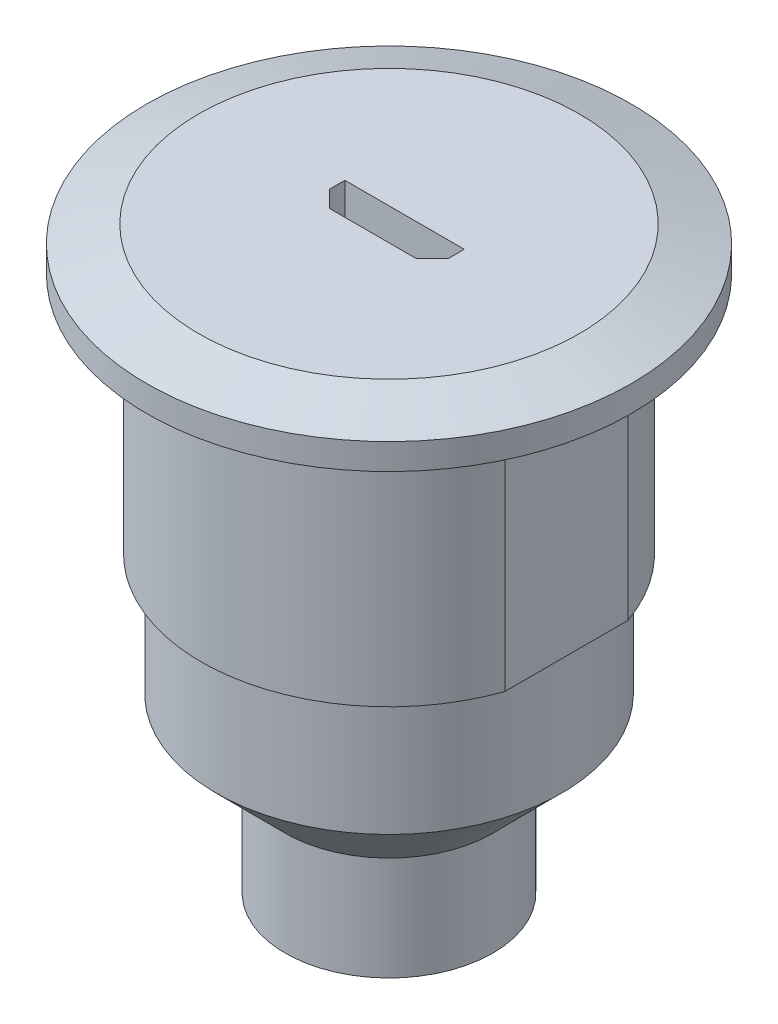
ISO-10303-21;
HEADER;
FILE_DESCRIPTION(('STEP AP214'),'2;1');
FILE_NAME('part.step','',(''),(''),'','','');
FILE_SCHEMA(('AUTOMOTIVE_DESIGN { 1 0 10303 214 1 1 1 1 }'));
ENDSEC;
DATA;
#1=APPLICATION_CONTEXT('core data for automotive mechanical design processes');
#2=APPLICATION_PROTOCOL_DEFINITION('international standard','automotive_design',2000,#1);
#3=PRODUCT_CONTEXT('',#1,'mechanical');
#4=PRODUCT('Part','Part','',(#3));
#5=PRODUCT_RELATED_PRODUCT_CATEGORY('part','',(#4));
#6=PRODUCT_DEFINITION_FORMATION('','',#4);
#7=PRODUCT_DEFINITION_CONTEXT('part definition',#1,'design');
#8=PRODUCT_DEFINITION('design','',#6,#7);
#9=PRODUCT_DEFINITION_SHAPE('','',#8);
#10=(LENGTH_UNIT() NAMED_UNIT(*) SI_UNIT(.MILLI.,.METRE.));
#11=(NAMED_UNIT(*) PLANE_ANGLE_UNIT() SI_UNIT($,.RADIAN.));
#12=(NAMED_UNIT(*) SI_UNIT($,.STERADIAN.) SOLID_ANGLE_UNIT());
#13=UNCERTAINTY_MEASURE_WITH_UNIT(LENGTH_MEASURE(1.E-05),#10,'distance_accuracy_value','');
#14=(GEOMETRIC_REPRESENTATION_CONTEXT(3) GLOBAL_UNCERTAINTY_ASSIGNED_CONTEXT((#13)) GLOBAL_UNIT_ASSIGNED_CONTEXT((#10,
#11,#12)) REPRESENTATION_CONTEXT('',''));
#15=CARTESIAN_POINT('',(0.,0.,0.));
#16=DIRECTION('',(0.,0.,1.));
#17=DIRECTION('',(1.,0.,0.));
#18=AXIS2_PLACEMENT_3D('',#15,#16,#17);
#19=CARTESIAN_POINT('',(0.,33.5,0.));
#20=DIRECTION('',(0.,1.,0.));
#21=DIRECTION('',(-1.,0.,0.));
#22=AXIS2_PLACEMENT_3D('',#19,#20,#21);
#23=CYLINDRICAL_SURFACE('',#22,10.85);
#24=DIRECTION('',(0.,1.,0.));
#25=VECTOR('',#24,1.);
#26=CARTESIAN_POINT('',(-10.25,33.5,-3.55808937493144));
#27=LINE('',#26,#25);
#28=CARTESIAN_POINT('',(-10.25,17.,-3.55808937493143));
#29=VERTEX_POINT('',#28);
#30=CARTESIAN_POINT('',(-10.25,31.,-3.55808937493144));
#31=VERTEX_POINT('',#30);
#32=EDGE_CURVE('E49',#29,#31,#27,.T.);
#33=ORIENTED_EDGE('',*,*,#32,.T.);
#34=CARTESIAN_POINT('',(0.,31.,0.));
#35=DIRECTION('',(0.,1.,0.));
#36=DIRECTION('',(-1.,0.,0.));
#37=AXIS2_PLACEMENT_3D('',#34,#35,#36);
#38=CIRCLE('',#37,10.85);
#39=CARTESIAN_POINT('',(10.25,31.,-3.55808937493144));
#40=VERTEX_POINT('',#39);
#41=EDGE_CURVE('E131',#40,#31,#38,.T.);
#42=ORIENTED_EDGE('',*,*,#41,.F.);
#43=DIRECTION('',(0.,1.,0.));
#44=VECTOR('',#43,1.);
#45=CARTESIAN_POINT('',(10.25,33.5,-3.55808937493144));
#46=LINE('',#45,#44);
#47=CARTESIAN_POINT('',(10.25,17.,-3.55808937493145));
#48=VERTEX_POINT('',#47);
#49=EDGE_CURVE('E341',#40,#48,#46,.F.);
#50=ORIENTED_EDGE('',*,*,#49,.T.);
#51=CARTESIAN_POINT('',(0.,17.,0.));
#52=DIRECTION('',(0.,1.,0.));
#53=DIRECTION('',(-1.,0.,0.));
#54=AXIS2_PLACEMENT_3D('',#51,#52,#53);
#55=CIRCLE('',#54,10.85);
#56=EDGE_CURVE('E132',#48,#29,#55,.T.);
#57=ORIENTED_EDGE('',*,*,#56,.T.);
#58=EDGE_LOOP('',(#33,#42,#50,#57));
#59=FACE_BOUND('',#58,.T.);
#60=ADVANCED_FACE('F34',(#59),#23,.T.);
#61=CARTESIAN_POINT('',(0.,33.5,0.));
#62=DIRECTION('',(0.,1.,0.));
#63=DIRECTION('',(-1.,0.,0.));
#64=AXIS2_PLACEMENT_3D('',#61,#62,#63);
#65=PLANE('',#64);
#66=DIRECTION('',(0.,0.,-1.));
#67=VECTOR('',#66,1.);
#68=CARTESIAN_POINT('',(3.45,33.5,-0.900000000000001));
#69=LINE('',#68,#67);
#70=CARTESIAN_POINT('',(3.45,33.5,0.));
#71=VERTEX_POINT('',#70);
#72=CARTESIAN_POINT('',(3.45,33.5,-0.900000000000001));
#73=VERTEX_POINT('',#72);
#74=EDGE_CURVE('E117',#71,#73,#69,.T.);
#75=ORIENTED_EDGE('',*,*,#74,.F.);
#76=DIRECTION('',(0.707106781186548,0.,-0.707106781186547));
#77=VECTOR('',#76,1.);
#78=CARTESIAN_POINT('',(3.45,33.5,0.));
#79=LINE('',#78,#77);
#80=CARTESIAN_POINT('',(2.5,33.5,0.95));
#81=VERTEX_POINT('',#80);
#82=EDGE_CURVE('E355',#81,#71,#79,.T.);
#83=ORIENTED_EDGE('',*,*,#82,.F.);
#84=DIRECTION('',(1.,0.,0.));
#85=VECTOR('',#84,1.);
#86=CARTESIAN_POINT('',(2.5,33.5,0.95));
#87=LINE('',#86,#85);
#88=CARTESIAN_POINT('',(-2.50000000000001,33.5,0.949999999999999));
#89=VERTEX_POINT('',#88);
#90=EDGE_CURVE('E381',#89,#81,#87,.T.);
#91=ORIENTED_EDGE('',*,*,#90,.F.);
#92=DIRECTION('',(0.707106781186548,0.,0.707106781186547));
#93=VECTOR('',#92,1.);
#94=CARTESIAN_POINT('',(-2.50000000000001,33.5,0.949999999999999));
#95=LINE('',#94,#93);
#96=CARTESIAN_POINT('',(-3.45000000000001,33.5,0.));
#97=VERTEX_POINT('',#96);
#98=EDGE_CURVE('E378',#97,#89,#95,.T.);
#99=ORIENTED_EDGE('',*,*,#98,.F.);
#100=DIRECTION('',(0.,0.,1.));
#101=VECTOR('',#100,1.);
#102=CARTESIAN_POINT('',(-3.45000000000001,33.5,0.));
#103=LINE('',#102,#101);
#104=CARTESIAN_POINT('',(-3.45000000000001,33.5,-0.900000000000001));
#105=VERTEX_POINT('',#104);
#106=EDGE_CURVE('E375',#105,#97,#103,.T.);
#107=ORIENTED_EDGE('',*,*,#106,.F.);
#108=DIRECTION('',(-1.,0.,0.));
#109=VECTOR('',#108,1.);
#110=CARTESIAN_POINT('',(-3.45000000000001,33.5,-0.900000000000001));
#111=LINE('',#110,#109);
#112=EDGE_CURVE('E372',#73,#105,#111,.T.);
#113=ORIENTED_EDGE('',*,*,#112,.F.);
#114=EDGE_LOOP('',(#75,#83,#91,#99,#107,#113));
#115=FACE_BOUND('',#114,.T.);
#116=CARTESIAN_POINT('',(0.,33.5,0.));
#117=DIRECTION('',(0.,1.,0.));
#118=DIRECTION('',(-1.,0.,0.));
#119=AXIS2_PLACEMENT_3D('',#116,#117,#118);
#120=CIRCLE('',#119,11.);
#121=CARTESIAN_POINT('',(-11.,33.5,0.));
#122=VERTEX_POINT('',#121);
#123=EDGE_CURVE('E11',#122,#122,#120,.T.);
#124=ORIENTED_EDGE('',*,*,#123,.T.);
#125=EDGE_LOOP('',(#124));
#126=FACE_BOUND('',#125,.T.);
#127=ADVANCED_FACE('F36',(#115,#126),#65,.T.);
#128=CARTESIAN_POINT('',(0.,33.5,0.));
#129=DIRECTION('',(0.,-1.,0.));
#130=DIRECTION('',(1.,0.,0.));
#131=AXIS2_PLACEMENT_3D('',#128,#129,#130);
#132=CONICAL_SURFACE('',#131,11.,1.24904577239825);
#133=CARTESIAN_POINT('',(0.,32.5,0.));
#134=DIRECTION('',(0.,1.,0.));
#135=DIRECTION('',(-1.,0.,0.));
#136=AXIS2_PLACEMENT_3D('',#133,#134,#135);
#137=CIRCLE('',#136,14.);
#138=CARTESIAN_POINT('',(-14.,32.5,0.));
#139=VERTEX_POINT('',#138);
#140=EDGE_CURVE('E42',#139,#139,#137,.T.);
#141=ORIENTED_EDGE('',*,*,#140,.T.);
#142=EDGE_LOOP('',(#141));
#143=FACE_BOUND('',#142,.T.);
#144=ORIENTED_EDGE('',*,*,#123,.F.);
#145=EDGE_LOOP('',(#144));
#146=FACE_BOUND('',#145,.T.);
#147=ADVANCED_FACE('F145',(#143,#146),#132,.T.);
#148=CARTESIAN_POINT('',(0.,33.5,0.));
#149=DIRECTION('',(0.,1.,0.));
#150=DIRECTION('',(-1.,0.,0.));
#151=AXIS2_PLACEMENT_3D('',#148,#149,#150);
#152=CYLINDRICAL_SURFACE('',#151,14.);
#153=CARTESIAN_POINT('',(0.,31.,0.));
#154=DIRECTION('',(0.,1.,0.));
#155=DIRECTION('',(-1.,0.,0.));
#156=AXIS2_PLACEMENT_3D('',#153,#154,#155);
#157=CIRCLE('',#156,14.);
#158=CARTESIAN_POINT('',(-14.,31.,0.));
#159=VERTEX_POINT('',#158);
#160=EDGE_CURVE('E140',#159,#159,#157,.T.);
#161=ORIENTED_EDGE('',*,*,#160,.T.);
#162=EDGE_LOOP('',(#161));
#163=FACE_BOUND('',#162,.T.);
#164=ORIENTED_EDGE('',*,*,#140,.F.);
#165=EDGE_LOOP('',(#164));
#166=FACE_BOUND('',#165,.T.);
#167=ADVANCED_FACE('F148',(#163,#166),#152,.T.);
#168=CARTESIAN_POINT('',(-14.,31.,0.));
#169=DIRECTION('',(0.,-1.,0.));
#170=DIRECTION('',(1.,0.,0.));
#171=AXIS2_PLACEMENT_3D('',#168,#169,#170);
#172=PLANE('',#171);
#173=CARTESIAN_POINT('',(-10.25,31.,3.55808937493144));
#174=VERTEX_POINT('',#173);
#175=CARTESIAN_POINT('',(10.25,31.,3.55808937493144));
#176=VERTEX_POINT('',#175);
#177=EDGE_CURVE('E126',#174,#176,#38,.T.);
#178=ORIENTED_EDGE('',*,*,#177,.T.);
#179=DIRECTION('',(0.,0.,-1.));
#180=VECTOR('',#179,1.);
#181=CARTESIAN_POINT('',(10.25,31.,14.001));
#182=LINE('',#181,#180);
#183=EDGE_CURVE('E343',#176,#40,#182,.T.);
#184=ORIENTED_EDGE('',*,*,#183,.T.);
#185=ORIENTED_EDGE('',*,*,#41,.T.);
#186=DIRECTION('',(0.,0.,-1.));
#187=VECTOR('',#186,1.);
#188=CARTESIAN_POINT('',(-10.25,31.,14.001));
#189=LINE('',#188,#187);
#190=EDGE_CURVE('E118',#174,#31,#189,.T.);
#191=ORIENTED_EDGE('',*,*,#190,.F.);
#192=EDGE_LOOP('',(#178,#184,#185,#191));
#193=FACE_BOUND('',#192,.T.);
#194=ORIENTED_EDGE('',*,*,#160,.F.);
#195=EDGE_LOOP('',(#194));
#196=FACE_BOUND('',#195,.T.);
#197=ADVANCED_FACE('F150',(#193,#196),#172,.T.);
#198=DIRECTION('',(0.,1.,0.));
#199=VECTOR('',#198,1.);
#200=CARTESIAN_POINT('',(-10.25,33.5,3.55808937493144));
#201=LINE('',#200,#199);
#202=CARTESIAN_POINT('',(-10.25,17.,3.55808937493143));
#203=VERTEX_POINT('',#202);
#204=EDGE_CURVE('E111',#174,#203,#201,.F.);
#205=ORIENTED_EDGE('',*,*,#204,.T.);
#206=CARTESIAN_POINT('',(10.25,17.,3.55808937493145));
#207=VERTEX_POINT('',#206);
#208=EDGE_CURVE('E124',#203,#207,#55,.T.);
#209=ORIENTED_EDGE('',*,*,#208,.T.);
#210=DIRECTION('',(0.,1.,0.));
#211=VECTOR('',#210,1.);
#212=CARTESIAN_POINT('',(10.25,33.5,3.55808937493144));
#213=LINE('',#212,#211);
#214=EDGE_CURVE('E57',#207,#176,#213,.T.);
#215=ORIENTED_EDGE('',*,*,#214,.T.);
#216=ORIENTED_EDGE('',*,*,#177,.F.);
#217=EDGE_LOOP('',(#205,#209,#215,#216));
#218=FACE_BOUND('',#217,.T.);
#219=ADVANCED_FACE('F123',(#218),#23,.T.);
#220=CARTESIAN_POINT('',(-10.85,17.,0.));
#221=DIRECTION('',(0.,-1.,0.));
#222=DIRECTION('',(1.,0.,0.));
#223=AXIS2_PLACEMENT_3D('',#220,#221,#222);
#224=PLANE('',#223);
#225=DIRECTION('',(0.,0.,-1.));
#226=VECTOR('',#225,1.);
#227=CARTESIAN_POINT('',(-10.25,17.,14.001));
#228=LINE('',#227,#226);
#229=EDGE_CURVE('E108',#203,#29,#228,.T.);
#230=ORIENTED_EDGE('',*,*,#229,.T.);
#231=ORIENTED_EDGE('',*,*,#56,.F.);
#232=DIRECTION('',(0.,0.,-1.));
#233=VECTOR('',#232,1.);
#234=CARTESIAN_POINT('',(10.25,17.,14.001));
#235=LINE('',#234,#233);
#236=EDGE_CURVE('E127',#207,#48,#235,.T.);
#237=ORIENTED_EDGE('',*,*,#236,.F.);
#238=ORIENTED_EDGE('',*,*,#208,.F.);
#239=EDGE_LOOP('',(#230,#231,#237,#238));
#240=FACE_BOUND('',#239,.T.);
#241=CARTESIAN_POINT('',(0.,17.,0.));
#242=DIRECTION('',(0.,1.,0.));
#243=DIRECTION('',(-1.,0.,0.));
#244=AXIS2_PLACEMENT_3D('',#241,#242,#243);
#245=CIRCLE('',#244,9.985);
#246=CARTESIAN_POINT('',(-9.98499999999999,17.,0.));
#247=VERTEX_POINT('',#246);
#248=EDGE_CURVE('E136',#247,#247,#245,.T.);
#249=ORIENTED_EDGE('',*,*,#248,.T.);
#250=EDGE_LOOP('',(#249));
#251=FACE_BOUND('',#250,.T.);
#252=ADVANCED_FACE('F129',(#240,#251),#224,.T.);
#253=CARTESIAN_POINT('',(0.,33.5,0.));
#254=DIRECTION('',(0.,1.,0.));
#255=DIRECTION('',(-1.,0.,0.));
#256=AXIS2_PLACEMENT_3D('',#253,#254,#255);
#257=CYLINDRICAL_SURFACE('',#256,9.985);
#258=CARTESIAN_POINT('',(0.,10.,0.));
#259=DIRECTION('',(0.,1.,0.));
#260=DIRECTION('',(-1.,0.,0.));
#261=AXIS2_PLACEMENT_3D('',#258,#259,#260);
#262=CIRCLE('',#261,9.985);
#263=CARTESIAN_POINT('',(-9.985,10.,0.));
#264=VERTEX_POINT('',#263);
#265=EDGE_CURVE('E403',#264,#264,#262,.T.);
#266=ORIENTED_EDGE('',*,*,#265,.T.);
#267=EDGE_LOOP('',(#266));
#268=FACE_BOUND('',#267,.T.);
#269=ORIENTED_EDGE('',*,*,#248,.F.);
#270=EDGE_LOOP('',(#269));
#271=FACE_BOUND('',#270,.T.);
#272=ADVANCED_FACE('F171',(#268,#271),#257,.T.);
#273=CARTESIAN_POINT('',(0.,10.,0.));
#274=DIRECTION('',(0.,1.,0.));
#275=DIRECTION('',(-1.,0.,0.));
#276=AXIS2_PLACEMENT_3D('',#273,#274,#275);
#277=CONICAL_SURFACE('',#276,9.985,0.783519643377935);
#278=CARTESIAN_POINT('',(0.,6.,0.));
#279=DIRECTION('',(0.,1.,0.));
#280=DIRECTION('',(-1.,0.,0.));
#281=AXIS2_PLACEMENT_3D('',#278,#279,#280);
#282=CIRCLE('',#281,6.);
#283=CARTESIAN_POINT('',(-6.,6.,0.));
#284=VERTEX_POINT('',#283);
#285=EDGE_CURVE('E401',#284,#284,#282,.T.);
#286=ORIENTED_EDGE('',*,*,#285,.T.);
#287=EDGE_LOOP('',(#286));
#288=FACE_BOUND('',#287,.T.);
#289=ORIENTED_EDGE('',*,*,#265,.F.);
#290=EDGE_LOOP('',(#289));
#291=FACE_BOUND('',#290,.T.);
#292=ADVANCED_FACE('F175',(#288,#291),#277,.T.);
#293=CARTESIAN_POINT('',(0.,33.5,0.));
#294=DIRECTION('',(0.,1.,0.));
#295=DIRECTION('',(-1.,0.,0.));
#296=AXIS2_PLACEMENT_3D('',#293,#294,#295);
#297=CYLINDRICAL_SURFACE('',#296,6.);
#298=CARTESIAN_POINT('',(0.,0.,0.));
#299=DIRECTION('',(0.,1.,0.));
#300=DIRECTION('',(-1.,0.,0.));
#301=AXIS2_PLACEMENT_3D('',#298,#299,#300);
#302=CIRCLE('',#301,6.00000000000001);
#303=CARTESIAN_POINT('',(-6.,0.,0.));
#304=VERTEX_POINT('',#303);
#305=EDGE_CURVE('E388',#304,#304,#302,.T.);
#306=ORIENTED_EDGE('',*,*,#305,.T.);
#307=EDGE_LOOP('',(#306));
#308=FACE_BOUND('',#307,.T.);
#309=ORIENTED_EDGE('',*,*,#285,.F.);
#310=EDGE_LOOP('',(#309));
#311=FACE_BOUND('',#310,.T.);
#312=ADVANCED_FACE('F181',(#308,#311),#297,.T.);
#313=CARTESIAN_POINT('',(-6.,0.,0.));
#314=DIRECTION('',(0.,-1.,0.));
#315=DIRECTION('',(1.,0.,0.));
#316=AXIS2_PLACEMENT_3D('',#313,#314,#315);
#317=PLANE('',#316);
#318=ORIENTED_EDGE('',*,*,#305,.F.);
#319=EDGE_LOOP('',(#318));
#320=FACE_BOUND('',#319,.T.);
#321=ADVANCED_FACE('F185',(#320),#317,.T.);
#322=CARTESIAN_POINT('',(3.45,28.5,-0.900000000000001));
#323=DIRECTION('',(1.,0.,0.));
#324=DIRECTION('',(0.,1.,0.));
#325=AXIS2_PLACEMENT_3D('',#322,#323,#324);
#326=PLANE('',#325);
#327=ORIENTED_EDGE('',*,*,#74,.T.);
#328=DIRECTION('',(0.,1.,0.));
#329=VECTOR('',#328,1.);
#330=CARTESIAN_POINT('',(3.45,28.5,-0.900000000000001));
#331=LINE('',#330,#329);
#332=CARTESIAN_POINT('',(3.45,28.5,-0.900000000000001));
#333=VERTEX_POINT('',#332);
#334=EDGE_CURVE('E370',#333,#73,#331,.T.);
#335=ORIENTED_EDGE('',*,*,#334,.F.);
#336=DIRECTION('',(0.,0.,-1.));
#337=VECTOR('',#336,1.);
#338=CARTESIAN_POINT('',(3.45,28.5,-0.900000000000001));
#339=LINE('',#338,#337);
#340=CARTESIAN_POINT('',(3.45,28.5,0.));
#341=VERTEX_POINT('',#340);
#342=EDGE_CURVE('E351',#341,#333,#339,.T.);
#343=ORIENTED_EDGE('',*,*,#342,.F.);
#344=DIRECTION('',(0.,1.,0.));
#345=VECTOR('',#344,1.);
#346=CARTESIAN_POINT('',(3.45,28.5,0.));
#347=LINE('',#346,#345);
#348=EDGE_CURVE('E386',#341,#71,#347,.T.);
#349=ORIENTED_EDGE('',*,*,#348,.T.);
#350=EDGE_LOOP('',(#327,#335,#343,#349));
#351=FACE_BOUND('',#350,.T.);
#352=ADVANCED_FACE('F189',(#351),#326,.F.);
#353=CARTESIAN_POINT('',(3.45,28.5,0.));
#354=DIRECTION('',(0.707106781186547,0.,0.707106781186548));
#355=DIRECTION('',(0.707106781186548,0.,-0.707106781186547));
#356=AXIS2_PLACEMENT_3D('',#353,#354,#355);
#357=PLANE('',#356);
#358=ORIENTED_EDGE('',*,*,#82,.T.);
#359=ORIENTED_EDGE('',*,*,#348,.F.);
#360=DIRECTION('',(0.707106781186548,0.,-0.707106781186547));
#361=VECTOR('',#360,1.);
#362=CARTESIAN_POINT('',(3.45,28.5,0.));
#363=LINE('',#362,#361);
#364=CARTESIAN_POINT('',(2.5,28.5,0.95));
#365=VERTEX_POINT('',#364);
#366=EDGE_CURVE('E367',#365,#341,#363,.T.);
#367=ORIENTED_EDGE('',*,*,#366,.F.);
#368=DIRECTION('',(0.,1.,0.));
#369=VECTOR('',#368,1.);
#370=CARTESIAN_POINT('',(2.5,28.5,0.95));
#371=LINE('',#370,#369);
#372=EDGE_CURVE('E389',#365,#81,#371,.T.);
#373=ORIENTED_EDGE('',*,*,#372,.T.);
#374=EDGE_LOOP('',(#358,#359,#367,#373));
#375=FACE_BOUND('',#374,.T.);
#376=ADVANCED_FACE('F193',(#375),#357,.F.);
#377=CARTESIAN_POINT('',(2.5,28.5,0.95));
#378=DIRECTION('',(0.,0.,1.));
#379=DIRECTION('',(1.,0.,0.));
#380=AXIS2_PLACEMENT_3D('',#377,#378,#379);
#381=PLANE('',#380);
#382=ORIENTED_EDGE('',*,*,#90,.T.);
#383=ORIENTED_EDGE('',*,*,#372,.F.);
#384=DIRECTION('',(1.,0.,0.));
#385=VECTOR('',#384,1.);
#386=CARTESIAN_POINT('',(2.5,28.5,0.95));
#387=LINE('',#386,#385);
#388=CARTESIAN_POINT('',(-2.5,28.5,0.949999999999999));
#389=VERTEX_POINT('',#388);
#390=EDGE_CURVE('E364',#389,#365,#387,.T.);
#391=ORIENTED_EDGE('',*,*,#390,.F.);
#392=DIRECTION('',(0.,1.,0.));
#393=VECTOR('',#392,1.);
#394=CARTESIAN_POINT('',(-2.5,28.5,0.949999999999999));
#395=LINE('',#394,#393);
#396=EDGE_CURVE('E391',#389,#89,#395,.T.);
#397=ORIENTED_EDGE('',*,*,#396,.T.);
#398=EDGE_LOOP('',(#382,#383,#391,#397));
#399=FACE_BOUND('',#398,.T.);
#400=ADVANCED_FACE('F207',(#399),#381,.F.);
#401=CARTESIAN_POINT('',(-2.5,28.5,0.949999999999999));
#402=DIRECTION('',(-0.707106781186547,0.,0.707106781186548));
#403=DIRECTION('',(0.707106781186548,0.,0.707106781186547));
#404=AXIS2_PLACEMENT_3D('',#401,#402,#403);
#405=PLANE('',#404);
#406=ORIENTED_EDGE('',*,*,#98,.T.);
#407=ORIENTED_EDGE('',*,*,#396,.F.);
#408=DIRECTION('',(0.707106781186548,0.,0.707106781186547));
#409=VECTOR('',#408,1.);
#410=CARTESIAN_POINT('',(-2.5,28.5,0.949999999999999));
#411=LINE('',#410,#409);
#412=CARTESIAN_POINT('',(-3.45,28.5,0.));
#413=VERTEX_POINT('',#412);
#414=EDGE_CURVE('E361',#413,#389,#411,.T.);
#415=ORIENTED_EDGE('',*,*,#414,.F.);
#416=DIRECTION('',(0.,1.,0.));
#417=VECTOR('',#416,1.);
#418=CARTESIAN_POINT('',(-3.45,28.5,0.));
#419=LINE('',#418,#417);
#420=EDGE_CURVE('E393',#413,#97,#419,.T.);
#421=ORIENTED_EDGE('',*,*,#420,.T.);
#422=EDGE_LOOP('',(#406,#407,#415,#421));
#423=FACE_BOUND('',#422,.T.);
#424=ADVANCED_FACE('F203',(#423),#405,.F.);
#425=CARTESIAN_POINT('',(-3.45,28.5,0.));
#426=DIRECTION('',(-1.,0.,0.));
#427=DIRECTION('',(0.,-1.,0.));
#428=AXIS2_PLACEMENT_3D('',#425,#426,#427);
#429=PLANE('',#428);
#430=ORIENTED_EDGE('',*,*,#106,.T.);
#431=ORIENTED_EDGE('',*,*,#420,.F.);
#432=DIRECTION('',(0.,0.,1.));
#433=VECTOR('',#432,1.);
#434=CARTESIAN_POINT('',(-3.45,28.5,0.));
#435=LINE('',#434,#433);
#436=CARTESIAN_POINT('',(-3.45,28.5,-0.900000000000001));
#437=VERTEX_POINT('',#436);
#438=EDGE_CURVE('E358',#437,#413,#435,.T.);
#439=ORIENTED_EDGE('',*,*,#438,.F.);
#440=DIRECTION('',(0.,1.,0.));
#441=VECTOR('',#440,1.);
#442=CARTESIAN_POINT('',(-3.45,28.5,-0.900000000000001));
#443=LINE('',#442,#441);
#444=EDGE_CURVE('E395',#437,#105,#443,.T.);
#445=ORIENTED_EDGE('',*,*,#444,.T.);
#446=EDGE_LOOP('',(#430,#431,#439,#445));
#447=FACE_BOUND('',#446,.T.);
#448=ADVANCED_FACE('F199',(#447),#429,.F.);
#449=CARTESIAN_POINT('',(-3.45,28.5,-0.900000000000001));
#450=DIRECTION('',(0.,0.,-1.));
#451=DIRECTION('',(-1.,0.,0.));
#452=AXIS2_PLACEMENT_3D('',#449,#450,#451);
#453=PLANE('',#452);
#454=ORIENTED_EDGE('',*,*,#112,.T.);
#455=ORIENTED_EDGE('',*,*,#444,.F.);
#456=DIRECTION('',(-1.,0.,0.));
#457=VECTOR('',#456,1.);
#458=CARTESIAN_POINT('',(-3.45,28.5,-0.900000000000001));
#459=LINE('',#458,#457);
#460=EDGE_CURVE('E354',#333,#437,#459,.T.);
#461=ORIENTED_EDGE('',*,*,#460,.F.);
#462=ORIENTED_EDGE('',*,*,#334,.T.);
#463=EDGE_LOOP('',(#454,#455,#461,#462));
#464=FACE_BOUND('',#463,.T.);
#465=ADVANCED_FACE('F195',(#464),#453,.F.);
#466=CARTESIAN_POINT('',(0.,28.5,0.));
#467=DIRECTION('',(0.,-1.,0.));
#468=DIRECTION('',(0.,0.,-1.));
#469=AXIS2_PLACEMENT_3D('',#466,#467,#468);
#470=PLANE('',#469);
#471=ORIENTED_EDGE('',*,*,#342,.T.);
#472=ORIENTED_EDGE('',*,*,#460,.T.);
#473=ORIENTED_EDGE('',*,*,#438,.T.);
#474=ORIENTED_EDGE('',*,*,#414,.T.);
#475=ORIENTED_EDGE('',*,*,#390,.T.);
#476=ORIENTED_EDGE('',*,*,#366,.T.);
#477=EDGE_LOOP('',(#471,#472,#473,#474,#475,#476));
#478=FACE_BOUND('',#477,.T.);
#479=ADVANCED_FACE('F198',(#478),#470,.F.);
#480=CARTESIAN_POINT('',(10.25,17.,14.001));
#481=DIRECTION('',(-1.,0.,0.));
#482=DIRECTION('',(0.,0.,1.));
#483=AXIS2_PLACEMENT_3D('',#480,#481,#482);
#484=PLANE('',#483);
#485=ORIENTED_EDGE('',*,*,#236,.T.);
#486=ORIENTED_EDGE('',*,*,#49,.F.);
#487=ORIENTED_EDGE('',*,*,#183,.F.);
#488=ORIENTED_EDGE('',*,*,#214,.F.);
#489=EDGE_LOOP('',(#485,#486,#487,#488));
#490=FACE_BOUND('',#489,.T.);
#491=ADVANCED_FACE('F217',(#490),#484,.F.);
#492=CARTESIAN_POINT('',(-10.25,17.,14.001));
#493=DIRECTION('',(1.,0.,0.));
#494=DIRECTION('',(0.,0.,-1.));
#495=AXIS2_PLACEMENT_3D('',#492,#493,#494);
#496=PLANE('',#495);
#497=ORIENTED_EDGE('',*,*,#229,.F.);
#498=ORIENTED_EDGE('',*,*,#204,.F.);
#499=ORIENTED_EDGE('',*,*,#190,.T.);
#500=ORIENTED_EDGE('',*,*,#32,.F.);
#501=EDGE_LOOP('',(#497,#498,#499,#500));
#502=FACE_BOUND('',#501,.T.);
#503=ADVANCED_FACE('F110',(#502),#496,.F.);
#504=CLOSED_SHELL('',(#60,#127,#147,#167,#197,#219,#252,#272,#292,#312,#321,#352,#376,#400,#424,
#448,#465,#479,#491,#503));
#505=MANIFOLD_SOLID_BREP('B2',#504);
#506=ADVANCED_BREP_SHAPE_REPRESENTATION('',(#18,#505),#14);
#507=SHAPE_DEFINITION_REPRESENTATION(#9,#506);
ENDSEC;
END-ISO-10303-21;
